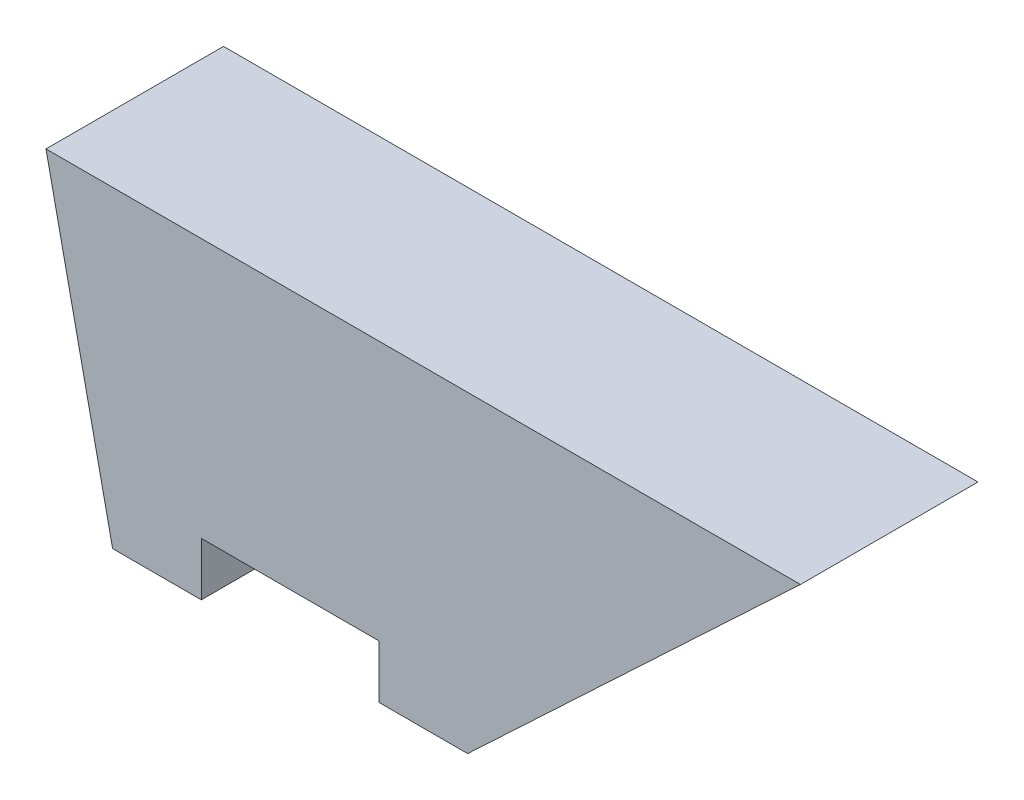
ISO-10303-21;
HEADER;
FILE_DESCRIPTION(('STEP AP214'),'2;1');
FILE_NAME('part.step','',(''),(''),'','','');
FILE_SCHEMA(('AUTOMOTIVE_DESIGN { 1 0 10303 214 1 1 1 1 }'));
ENDSEC;
DATA;
#1=APPLICATION_CONTEXT('core data for automotive mechanical design processes');
#2=APPLICATION_PROTOCOL_DEFINITION('international standard','automotive_design',2000,#1);
#3=PRODUCT_CONTEXT('',#1,'mechanical');
#4=PRODUCT('Part','Part','',(#3));
#5=PRODUCT_RELATED_PRODUCT_CATEGORY('part','',(#4));
#6=PRODUCT_DEFINITION_FORMATION('','',#4);
#7=PRODUCT_DEFINITION_CONTEXT('part definition',#1,'design');
#8=PRODUCT_DEFINITION('design','',#6,#7);
#9=PRODUCT_DEFINITION_SHAPE('','',#8);
#10=(LENGTH_UNIT() NAMED_UNIT(*) SI_UNIT(.MILLI.,.METRE.));
#11=(NAMED_UNIT(*) PLANE_ANGLE_UNIT() SI_UNIT($,.RADIAN.));
#12=(NAMED_UNIT(*) SI_UNIT($,.STERADIAN.) SOLID_ANGLE_UNIT());
#13=UNCERTAINTY_MEASURE_WITH_UNIT(LENGTH_MEASURE(1.E-05),#10,'distance_accuracy_value','');
#14=(GEOMETRIC_REPRESENTATION_CONTEXT(3) GLOBAL_UNCERTAINTY_ASSIGNED_CONTEXT((#13)) GLOBAL_UNIT_ASSIGNED_CONTEXT((#10,
#11,#12)) REPRESENTATION_CONTEXT('',''));
#15=CARTESIAN_POINT('',(0.,0.,0.));
#16=DIRECTION('',(0.,0.,1.));
#17=DIRECTION('',(1.,0.,0.));
#18=AXIS2_PLACEMENT_3D('',#15,#16,#17);
#19=CARTESIAN_POINT('',(-1.5,7.05,4.));
#20=DIRECTION('',(0.978105928984835,0.208107644464859,0.));
#21=DIRECTION('',(-0.208107644464859,0.978105928984836,0.));
#22=AXIS2_PLACEMENT_3D('',#19,#20,#21);
#23=PLANE('',#22);
#24=DIRECTION('',(0.208107644464859,-0.978105928984836,0.));
#25=VECTOR('',#24,1.);
#26=CARTESIAN_POINT('',(-1.5,7.05,0.));
#27=LINE('',#26,#25);
#28=CARTESIAN_POINT('',(-1.5,7.05,0.));
#29=VERTEX_POINT('',#28);
#30=CARTESIAN_POINT('',(0.,0.,0.));
#31=VERTEX_POINT('',#30);
#32=EDGE_CURVE('E184',#29,#31,#27,.T.);
#33=ORIENTED_EDGE('',*,*,#32,.T.);
#34=DIRECTION('',(0.,0.,-1.));
#35=VECTOR('',#34,1.);
#36=CARTESIAN_POINT('',(0.,0.,4.));
#37=LINE('',#36,#35);
#38=CARTESIAN_POINT('',(0.,0.,4.));
#39=VERTEX_POINT('',#38);
#40=EDGE_CURVE('E12',#39,#31,#37,.T.);
#41=ORIENTED_EDGE('',*,*,#40,.F.);
#42=DIRECTION('',(0.208107644464859,-0.978105928984836,0.));
#43=VECTOR('',#42,1.);
#44=CARTESIAN_POINT('',(-1.5,7.05,4.));
#45=LINE('',#44,#43);
#46=CARTESIAN_POINT('',(-1.5,7.05,4.));
#47=VERTEX_POINT('',#46);
#48=EDGE_CURVE('E151',#47,#39,#45,.T.);
#49=ORIENTED_EDGE('',*,*,#48,.F.);
#50=DIRECTION('',(0.,0.,-1.));
#51=VECTOR('',#50,1.);
#52=CARTESIAN_POINT('',(-1.5,7.05,4.));
#53=LINE('',#52,#51);
#54=EDGE_CURVE('E129',#47,#29,#53,.T.);
#55=ORIENTED_EDGE('',*,*,#54,.T.);
#56=EDGE_LOOP('',(#33,#41,#49,#55));
#57=FACE_BOUND('',#56,.T.);
#58=ADVANCED_FACE('F37',(#57),#23,.F.);
#59=CARTESIAN_POINT('',(2.,0.,4.));
#60=DIRECTION('',(0.,1.,0.));
#61=DIRECTION('',(-1.,0.,0.));
#62=AXIS2_PLACEMENT_3D('',#59,#60,#61);
#63=PLANE('',#62);
#64=DIRECTION('',(1.,0.,0.));
#65=VECTOR('',#64,1.);
#66=CARTESIAN_POINT('',(2.,0.,0.));
#67=LINE('',#66,#65);
#68=CARTESIAN_POINT('',(2.,0.,0.));
#69=VERTEX_POINT('',#68);
#70=EDGE_CURVE('E178',#31,#69,#67,.T.);
#71=ORIENTED_EDGE('',*,*,#70,.T.);
#72=DIRECTION('',(0.,0.,-1.));
#73=VECTOR('',#72,1.);
#74=CARTESIAN_POINT('',(2.,0.,4.));
#75=LINE('',#74,#73);
#76=CARTESIAN_POINT('',(2.,0.,4.));
#77=VERTEX_POINT('',#76);
#78=EDGE_CURVE('E45',#77,#69,#75,.T.);
#79=ORIENTED_EDGE('',*,*,#78,.F.);
#80=DIRECTION('',(1.,0.,0.));
#81=VECTOR('',#80,1.);
#82=CARTESIAN_POINT('',(2.,0.,4.));
#83=LINE('',#82,#81);
#84=EDGE_CURVE('E96',#39,#77,#83,.T.);
#85=ORIENTED_EDGE('',*,*,#84,.F.);
#86=ORIENTED_EDGE('',*,*,#40,.T.);
#87=EDGE_LOOP('',(#71,#79,#85,#86));
#88=FACE_BOUND('',#87,.T.);
#89=ADVANCED_FACE('F203',(#88),#63,.F.);
#90=CARTESIAN_POINT('',(2.,1.2,4.));
#91=DIRECTION('',(-1.,0.,0.));
#92=DIRECTION('',(0.,0.,1.));
#93=AXIS2_PLACEMENT_3D('',#90,#91,#92);
#94=PLANE('',#93);
#95=DIRECTION('',(0.,1.,0.));
#96=VECTOR('',#95,1.);
#97=CARTESIAN_POINT('',(2.,1.2,0.));
#98=LINE('',#97,#96);
#99=CARTESIAN_POINT('',(2.,1.2,0.));
#100=VERTEX_POINT('',#99);
#101=EDGE_CURVE('E173',#69,#100,#98,.T.);
#102=ORIENTED_EDGE('',*,*,#101,.T.);
#103=DIRECTION('',(0.,0.,-1.));
#104=VECTOR('',#103,1.);
#105=CARTESIAN_POINT('',(2.,1.2,4.));
#106=LINE('',#105,#104);
#107=CARTESIAN_POINT('',(2.,1.2,4.));
#108=VERTEX_POINT('',#107);
#109=EDGE_CURVE('E165',#108,#100,#106,.T.);
#110=ORIENTED_EDGE('',*,*,#109,.F.);
#111=DIRECTION('',(0.,1.,0.));
#112=VECTOR('',#111,1.);
#113=CARTESIAN_POINT('',(2.,1.2,4.));
#114=LINE('',#113,#112);
#115=EDGE_CURVE('E144',#77,#108,#114,.T.);
#116=ORIENTED_EDGE('',*,*,#115,.F.);
#117=ORIENTED_EDGE('',*,*,#78,.T.);
#118=EDGE_LOOP('',(#102,#110,#116,#117));
#119=FACE_BOUND('',#118,.T.);
#120=ADVANCED_FACE('F171',(#119),#94,.F.);
#121=CARTESIAN_POINT('',(6.,1.2,4.));
#122=DIRECTION('',(0.,1.,0.));
#123=DIRECTION('',(-1.,0.,0.));
#124=AXIS2_PLACEMENT_3D('',#121,#122,#123);
#125=PLANE('',#124);
#126=DIRECTION('',(1.,0.,0.));
#127=VECTOR('',#126,1.);
#128=CARTESIAN_POINT('',(6.,1.2,0.));
#129=LINE('',#128,#127);
#130=CARTESIAN_POINT('',(6.,1.2,0.));
#131=VERTEX_POINT('',#130);
#132=EDGE_CURVE('E180',#100,#131,#129,.T.);
#133=ORIENTED_EDGE('',*,*,#132,.T.);
#134=DIRECTION('',(0.,0.,-1.));
#135=VECTOR('',#134,1.);
#136=CARTESIAN_POINT('',(6.,1.2,4.));
#137=LINE('',#136,#135);
#138=CARTESIAN_POINT('',(6.,1.2,4.));
#139=VERTEX_POINT('',#138);
#140=EDGE_CURVE('E162',#139,#131,#137,.T.);
#141=ORIENTED_EDGE('',*,*,#140,.F.);
#142=DIRECTION('',(1.,0.,0.));
#143=VECTOR('',#142,1.);
#144=CARTESIAN_POINT('',(6.,1.2,4.));
#145=LINE('',#144,#143);
#146=EDGE_CURVE('E141',#108,#139,#145,.T.);
#147=ORIENTED_EDGE('',*,*,#146,.F.);
#148=ORIENTED_EDGE('',*,*,#109,.T.);
#149=EDGE_LOOP('',(#133,#141,#147,#148));
#150=FACE_BOUND('',#149,.T.);
#151=ADVANCED_FACE('F210',(#150),#125,.F.);
#152=CARTESIAN_POINT('',(6.,0.,4.));
#153=DIRECTION('',(1.,0.,0.));
#154=DIRECTION('',(0.,0.,-1.));
#155=AXIS2_PLACEMENT_3D('',#152,#153,#154);
#156=PLANE('',#155);
#157=DIRECTION('',(0.,-1.,0.));
#158=VECTOR('',#157,1.);
#159=CARTESIAN_POINT('',(6.,0.,0.));
#160=LINE('',#159,#158);
#161=CARTESIAN_POINT('',(6.,0.,0.));
#162=VERTEX_POINT('',#161);
#163=EDGE_CURVE('E182',#131,#162,#160,.T.);
#164=ORIENTED_EDGE('',*,*,#163,.T.);
#165=DIRECTION('',(0.,0.,-1.));
#166=VECTOR('',#165,1.);
#167=CARTESIAN_POINT('',(6.,0.,4.));
#168=LINE('',#167,#166);
#169=CARTESIAN_POINT('',(6.,0.,4.));
#170=VERTEX_POINT('',#169);
#171=EDGE_CURVE('E124',#170,#162,#168,.T.);
#172=ORIENTED_EDGE('',*,*,#171,.F.);
#173=DIRECTION('',(0.,-1.,0.));
#174=VECTOR('',#173,1.);
#175=CARTESIAN_POINT('',(6.,0.,4.));
#176=LINE('',#175,#174);
#177=EDGE_CURVE('E115',#139,#170,#176,.T.);
#178=ORIENTED_EDGE('',*,*,#177,.F.);
#179=ORIENTED_EDGE('',*,*,#140,.T.);
#180=EDGE_LOOP('',(#164,#172,#178,#179));
#181=FACE_BOUND('',#180,.T.);
#182=ADVANCED_FACE('F188',(#181),#156,.F.);
#183=CARTESIAN_POINT('',(6.,0.,4.));
#184=DIRECTION('',(0.,1.,0.));
#185=DIRECTION('',(-1.,0.,0.));
#186=AXIS2_PLACEMENT_3D('',#183,#184,#185);
#187=PLANE('',#186);
#188=DIRECTION('',(1.,0.,0.));
#189=VECTOR('',#188,1.);
#190=CARTESIAN_POINT('',(6.,0.,0.));
#191=LINE('',#190,#189);
#192=CARTESIAN_POINT('',(8.,0.,0.));
#193=VERTEX_POINT('',#192);
#194=EDGE_CURVE('E123',#162,#193,#191,.T.);
#195=ORIENTED_EDGE('',*,*,#194,.T.);
#196=DIRECTION('',(0.,0.,-1.));
#197=VECTOR('',#196,1.);
#198=CARTESIAN_POINT('',(8.,0.,4.));
#199=LINE('',#198,#197);
#200=CARTESIAN_POINT('',(8.,0.,4.));
#201=VERTEX_POINT('',#200);
#202=EDGE_CURVE('E120',#201,#193,#199,.T.);
#203=ORIENTED_EDGE('',*,*,#202,.F.);
#204=DIRECTION('',(1.,0.,0.));
#205=VECTOR('',#204,1.);
#206=CARTESIAN_POINT('',(6.,0.,4.));
#207=LINE('',#206,#205);
#208=EDGE_CURVE('E109',#170,#201,#207,.T.);
#209=ORIENTED_EDGE('',*,*,#208,.F.);
#210=ORIENTED_EDGE('',*,*,#171,.T.);
#211=EDGE_LOOP('',(#195,#203,#209,#210));
#212=FACE_BOUND('',#211,.T.);
#213=ADVANCED_FACE('F121',(#212),#187,.F.);
#214=CARTESIAN_POINT('',(8.,0.,4.));
#215=DIRECTION('',(-0.684910008767887,0.728627668902007,0.));
#216=DIRECTION('',(-0.728627668902007,-0.684910008767887,0.));
#217=AXIS2_PLACEMENT_3D('',#214,#215,#216);
#218=PLANE('',#217);
#219=DIRECTION('',(0.728627668902007,0.684910008767887,0.));
#220=VECTOR('',#219,1.);
#221=CARTESIAN_POINT('',(8.,0.,0.));
#222=LINE('',#221,#220);
#223=CARTESIAN_POINT('',(15.5,7.05,0.));
#224=VERTEX_POINT('',#223);
#225=EDGE_CURVE('E82',#193,#224,#222,.T.);
#226=ORIENTED_EDGE('',*,*,#225,.T.);
#227=DIRECTION('',(0.,0.,-1.));
#228=VECTOR('',#227,1.);
#229=CARTESIAN_POINT('',(15.5,7.05,4.));
#230=LINE('',#229,#228);
#231=CARTESIAN_POINT('',(15.5,7.05,4.));
#232=VERTEX_POINT('',#231);
#233=EDGE_CURVE('E125',#232,#224,#230,.T.);
#234=ORIENTED_EDGE('',*,*,#233,.F.);
#235=DIRECTION('',(0.728627668902007,0.684910008767887,0.));
#236=VECTOR('',#235,1.);
#237=CARTESIAN_POINT('',(8.,0.,4.));
#238=LINE('',#237,#236);
#239=EDGE_CURVE('E113',#201,#232,#238,.T.);
#240=ORIENTED_EDGE('',*,*,#239,.F.);
#241=ORIENTED_EDGE('',*,*,#202,.T.);
#242=EDGE_LOOP('',(#226,#234,#240,#241));
#243=FACE_BOUND('',#242,.T.);
#244=ADVANCED_FACE('F127',(#243),#218,.F.);
#245=CARTESIAN_POINT('',(-1.5,7.05,4.));
#246=DIRECTION('',(0.,-1.,0.));
#247=DIRECTION('',(0.,0.,-1.));
#248=AXIS2_PLACEMENT_3D('',#245,#246,#247);
#249=PLANE('',#248);
#250=DIRECTION('',(-1.,0.,0.));
#251=VECTOR('',#250,1.);
#252=CARTESIAN_POINT('',(-1.5,7.05,0.));
#253=LINE('',#252,#251);
#254=EDGE_CURVE('E88',#224,#29,#253,.T.);
#255=ORIENTED_EDGE('',*,*,#254,.T.);
#256=ORIENTED_EDGE('',*,*,#54,.F.);
#257=DIRECTION('',(-1.,0.,0.));
#258=VECTOR('',#257,1.);
#259=CARTESIAN_POINT('',(-1.5,7.05,4.));
#260=LINE('',#259,#258);
#261=EDGE_CURVE('E53',#232,#47,#260,.T.);
#262=ORIENTED_EDGE('',*,*,#261,.F.);
#263=ORIENTED_EDGE('',*,*,#233,.T.);
#264=EDGE_LOOP('',(#255,#256,#262,#263));
#265=FACE_BOUND('',#264,.T.);
#266=ADVANCED_FACE('F192',(#265),#249,.F.);
#267=CARTESIAN_POINT('',(0.,0.,4.));
#268=DIRECTION('',(0.,0.,-1.));
#269=DIRECTION('',(-1.,0.,0.));
#270=AXIS2_PLACEMENT_3D('',#267,#268,#269);
#271=PLANE('',#270);
#272=ORIENTED_EDGE('',*,*,#48,.T.);
#273=ORIENTED_EDGE('',*,*,#84,.T.);
#274=ORIENTED_EDGE('',*,*,#115,.T.);
#275=ORIENTED_EDGE('',*,*,#146,.T.);
#276=ORIENTED_EDGE('',*,*,#177,.T.);
#277=ORIENTED_EDGE('',*,*,#208,.T.);
#278=ORIENTED_EDGE('',*,*,#239,.T.);
#279=ORIENTED_EDGE('',*,*,#261,.T.);
#280=EDGE_LOOP('',(#272,#273,#274,#275,#276,#277,#278,#279));
#281=FACE_BOUND('',#280,.T.);
#282=ADVANCED_FACE('F111',(#281),#271,.F.);
#283=CARTESIAN_POINT('',(0.,0.,0.));
#284=DIRECTION('',(0.,0.,-1.));
#285=DIRECTION('',(-1.,0.,0.));
#286=AXIS2_PLACEMENT_3D('',#283,#284,#285);
#287=PLANE('',#286);
#288=ORIENTED_EDGE('',*,*,#32,.F.);
#289=ORIENTED_EDGE('',*,*,#254,.F.);
#290=ORIENTED_EDGE('',*,*,#225,.F.);
#291=ORIENTED_EDGE('',*,*,#194,.F.);
#292=ORIENTED_EDGE('',*,*,#163,.F.);
#293=ORIENTED_EDGE('',*,*,#132,.F.);
#294=ORIENTED_EDGE('',*,*,#101,.F.);
#295=ORIENTED_EDGE('',*,*,#70,.F.);
#296=EDGE_LOOP('',(#288,#289,#290,#291,#292,#293,#294,#295));
#297=FACE_BOUND('',#296,.T.);
#298=ADVANCED_FACE('F177',(#297),#287,.T.);
#299=CLOSED_SHELL('',(#58,#89,#120,#151,#182,#213,#244,#266,#282,#298));
#300=MANIFOLD_SOLID_BREP('B2',#299);
#301=ADVANCED_BREP_SHAPE_REPRESENTATION('',(#18,#300),#14);
#302=SHAPE_DEFINITION_REPRESENTATION(#9,#301);
ENDSEC;
END-ISO-10303-21;
